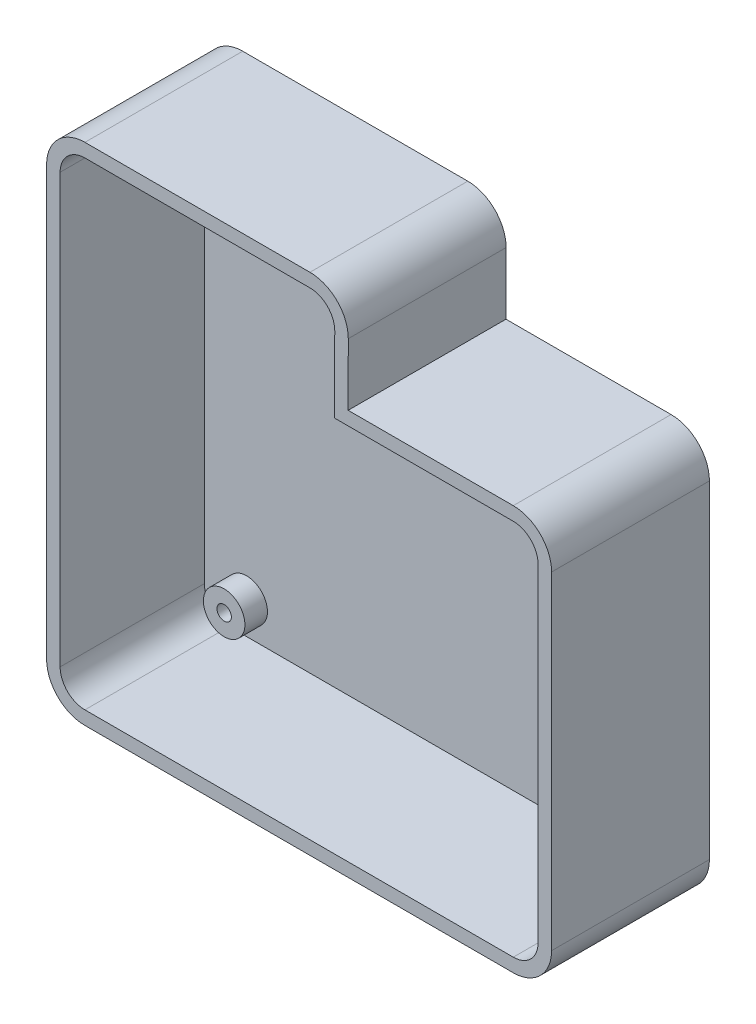
ISO-10303-21;
HEADER;
FILE_DESCRIPTION(('STEP AP214'),'2;1');
FILE_NAME('part.step','',(''),(''),'','','');
FILE_SCHEMA(('AUTOMOTIVE_DESIGN { 1 0 10303 214 1 1 1 1 }'));
ENDSEC;
DATA;
#1=APPLICATION_CONTEXT('core data for automotive mechanical design processes');
#2=APPLICATION_PROTOCOL_DEFINITION('international standard','automotive_design',2000,#1);
#3=PRODUCT_CONTEXT('',#1,'mechanical');
#4=PRODUCT('Part','Part','',(#3));
#5=PRODUCT_RELATED_PRODUCT_CATEGORY('part','',(#4));
#6=PRODUCT_DEFINITION_FORMATION('','',#4);
#7=PRODUCT_DEFINITION_CONTEXT('part definition',#1,'design');
#8=PRODUCT_DEFINITION('design','',#6,#7);
#9=PRODUCT_DEFINITION_SHAPE('','',#8);
#10=(LENGTH_UNIT() NAMED_UNIT(*) SI_UNIT(.MILLI.,.METRE.));
#11=(NAMED_UNIT(*) PLANE_ANGLE_UNIT() SI_UNIT($,.RADIAN.));
#12=(NAMED_UNIT(*) SI_UNIT($,.STERADIAN.) SOLID_ANGLE_UNIT());
#13=UNCERTAINTY_MEASURE_WITH_UNIT(LENGTH_MEASURE(1.E-05),#10,'distance_accuracy_value','');
#14=(GEOMETRIC_REPRESENTATION_CONTEXT(3) GLOBAL_UNCERTAINTY_ASSIGNED_CONTEXT((#13)) GLOBAL_UNIT_ASSIGNED_CONTEXT((#10,
#11,#12)) REPRESENTATION_CONTEXT('',''));
#15=CARTESIAN_POINT('',(0.,0.,0.));
#16=DIRECTION('',(0.,0.,1.));
#17=DIRECTION('',(1.,0.,0.));
#18=AXIS2_PLACEMENT_3D('',#15,#16,#17);
#19=CARTESIAN_POINT('',(-1.58351697458079,154.760976138155,35.));
#20=DIRECTION('',(0.,0.,-1.));
#21=DIRECTION('',(-1.,0.,0.));
#22=AXIS2_PLACEMENT_3D('',#19,#20,#21);
#23=CYLINDRICAL_SURFACE('',#22,1.6);
#24=CARTESIAN_POINT('',(-1.58351697458079,154.760976138155,0.));
#25=DIRECTION('',(0.,0.,1.));
#26=DIRECTION('',(1.,0.,0.));
#27=AXIS2_PLACEMENT_3D('',#24,#25,#26);
#28=CIRCLE('',#27,1.6);
#29=CARTESIAN_POINT('',(0.0164830254192046,154.760976138155,0.));
#30=VERTEX_POINT('',#29);
#31=EDGE_CURVE('E177',#30,#30,#28,.T.);
#32=ORIENTED_EDGE('',*,*,#31,.F.);
#33=EDGE_LOOP('',(#32));
#34=FACE_BOUND('',#33,.T.);
#35=CARTESIAN_POINT('',(-1.58351697458079,154.760976138155,8.));
#36=DIRECTION('',(0.,0.,1.));
#37=DIRECTION('',(1.,0.,0.));
#38=AXIS2_PLACEMENT_3D('',#35,#36,#37);
#39=CIRCLE('',#38,1.6);
#40=CARTESIAN_POINT('',(0.0164830254192046,154.760976138155,8.));
#41=VERTEX_POINT('',#40);
#42=EDGE_CURVE('E394',#41,#41,#39,.T.);
#43=ORIENTED_EDGE('',*,*,#42,.T.);
#44=EDGE_LOOP('',(#43));
#45=FACE_BOUND('',#44,.T.);
#46=ADVANCED_FACE('F40',(#34,#45),#23,.F.);
#47=CARTESIAN_POINT('',(38.108590223582,155.552573364995,35.));
#48=DIRECTION('',(0.,0.,-1.));
#49=DIRECTION('',(-1.,0.,0.));
#50=AXIS2_PLACEMENT_3D('',#47,#48,#49);
#51=CYLINDRICAL_SURFACE('',#50,1.6);
#52=CARTESIAN_POINT('',(38.108590223582,155.552573364995,0.));
#53=DIRECTION('',(0.,0.,1.));
#54=DIRECTION('',(1.,0.,0.));
#55=AXIS2_PLACEMENT_3D('',#52,#53,#54);
#56=CIRCLE('',#55,1.6);
#57=CARTESIAN_POINT('',(39.708590223582,155.552573364995,0.));
#58=VERTEX_POINT('',#57);
#59=EDGE_CURVE('E292',#58,#58,#56,.T.);
#60=ORIENTED_EDGE('',*,*,#59,.F.);
#61=EDGE_LOOP('',(#60));
#62=FACE_BOUND('',#61,.T.);
#63=CARTESIAN_POINT('',(38.108590223582,155.552573364995,8.));
#64=DIRECTION('',(0.,0.,1.));
#65=DIRECTION('',(1.,0.,0.));
#66=AXIS2_PLACEMENT_3D('',#63,#64,#65);
#67=CIRCLE('',#66,1.6);
#68=CARTESIAN_POINT('',(39.708590223582,155.552573364995,8.));
#69=VERTEX_POINT('',#68);
#70=EDGE_CURVE('E452',#69,#69,#67,.T.);
#71=ORIENTED_EDGE('',*,*,#70,.T.);
#72=EDGE_LOOP('',(#71));
#73=FACE_BOUND('',#72,.T.);
#74=ADVANCED_FACE('F499',(#62,#73),#51,.F.);
#75=CARTESIAN_POINT('',(-4.54984203299304,67.7845372845908,35.));
#76=DIRECTION('',(0.,0.,-1.));
#77=DIRECTION('',(-1.,0.,0.));
#78=AXIS2_PLACEMENT_3D('',#75,#76,#77);
#79=CYLINDRICAL_SURFACE('',#78,1.60000000000001);
#80=CARTESIAN_POINT('',(-4.54984203299304,67.7845372845908,0.));
#81=DIRECTION('',(0.,0.,1.));
#82=DIRECTION('',(1.,0.,0.));
#83=AXIS2_PLACEMENT_3D('',#80,#81,#82);
#84=CIRCLE('',#83,1.60000000000001);
#85=CARTESIAN_POINT('',(-2.94984203299303,67.7845372845908,0.));
#86=VERTEX_POINT('',#85);
#87=EDGE_CURVE('E296',#86,#86,#84,.T.);
#88=ORIENTED_EDGE('',*,*,#87,.F.);
#89=EDGE_LOOP('',(#88));
#90=FACE_BOUND('',#89,.T.);
#91=CARTESIAN_POINT('',(-4.54984203299304,67.7845372845908,8.));
#92=DIRECTION('',(0.,0.,1.));
#93=DIRECTION('',(1.,0.,0.));
#94=AXIS2_PLACEMENT_3D('',#91,#92,#93);
#95=CIRCLE('',#94,1.60000000000001);
#96=CARTESIAN_POINT('',(-2.94984203299303,67.7845372845908,8.));
#97=VERTEX_POINT('',#96);
#98=EDGE_CURVE('E456',#97,#97,#95,.T.);
#99=ORIENTED_EDGE('',*,*,#98,.T.);
#100=EDGE_LOOP('',(#99));
#101=FACE_BOUND('',#100,.T.);
#102=ADVANCED_FACE('F505',(#90,#101),#79,.F.);
#103=CARTESIAN_POINT('',(76.8180231596768,70.2074516428605,35.));
#104=DIRECTION('',(0.,0.,-1.));
#105=DIRECTION('',(-1.,0.,0.));
#106=AXIS2_PLACEMENT_3D('',#103,#104,#105);
#107=CYLINDRICAL_SURFACE('',#106,1.60000000000002);
#108=CARTESIAN_POINT('',(76.8180231596768,70.2074516428605,0.));
#109=DIRECTION('',(0.,0.,1.));
#110=DIRECTION('',(1.,0.,0.));
#111=AXIS2_PLACEMENT_3D('',#108,#109,#110);
#112=CIRCLE('',#111,1.60000000000002);
#113=CARTESIAN_POINT('',(78.4180231596768,70.2074516428605,0.));
#114=VERTEX_POINT('',#113);
#115=EDGE_CURVE('E300',#114,#114,#112,.T.);
#116=ORIENTED_EDGE('',*,*,#115,.F.);
#117=EDGE_LOOP('',(#116));
#118=FACE_BOUND('',#117,.T.);
#119=CARTESIAN_POINT('',(76.8180231596768,70.2074516428605,8.));
#120=DIRECTION('',(0.,0.,1.));
#121=DIRECTION('',(1.,0.,0.));
#122=AXIS2_PLACEMENT_3D('',#119,#120,#121);
#123=CIRCLE('',#122,1.60000000000002);
#124=CARTESIAN_POINT('',(78.4180231596768,70.2074516428605,8.));
#125=VERTEX_POINT('',#124);
#126=EDGE_CURVE('E460',#125,#125,#123,.T.);
#127=ORIENTED_EDGE('',*,*,#126,.T.);
#128=EDGE_LOOP('',(#127));
#129=FACE_BOUND('',#128,.T.);
#130=ADVANCED_FACE('F695',(#118,#129),#107,.F.);
#131=CARTESIAN_POINT('',(-1.58351697458079,154.760976138155,35.));
#132=DIRECTION('',(0.,0.,-1.));
#133=DIRECTION('',(-1.,0.,0.));
#134=AXIS2_PLACEMENT_3D('',#131,#132,#133);
#135=CYLINDRICAL_SURFACE('',#134,4.6);
#136=CARTESIAN_POINT('',(-1.58351697458079,154.760976138155,3.));
#137=DIRECTION('',(0.,0.,1.));
#138=DIRECTION('',(1.,0.,0.));
#139=AXIS2_PLACEMENT_3D('',#136,#137,#138);
#140=CIRCLE('',#139,4.6);
#141=CARTESIAN_POINT('',(3.0164830254192,154.760976138155,3.));
#142=VERTEX_POINT('',#141);
#143=EDGE_CURVE('E402',#142,#142,#140,.T.);
#144=ORIENTED_EDGE('',*,*,#143,.T.);
#145=EDGE_LOOP('',(#144));
#146=FACE_BOUND('',#145,.T.);
#147=CARTESIAN_POINT('',(-1.58351697458079,154.760976138155,8.));
#148=DIRECTION('',(0.,0.,1.));
#149=DIRECTION('',(1.,0.,0.));
#150=AXIS2_PLACEMENT_3D('',#147,#148,#149);
#151=CIRCLE('',#150,4.6);
#152=CARTESIAN_POINT('',(3.0164830254192,154.760976138155,8.));
#153=VERTEX_POINT('',#152);
#154=EDGE_CURVE('E464',#153,#153,#151,.T.);
#155=ORIENTED_EDGE('',*,*,#154,.F.);
#156=EDGE_LOOP('',(#155));
#157=FACE_BOUND('',#156,.T.);
#158=ADVANCED_FACE('F704',(#146,#157),#135,.T.);
#159=CARTESIAN_POINT('',(38.108590223582,155.552573364995,35.));
#160=DIRECTION('',(0.,0.,-1.));
#161=DIRECTION('',(-1.,0.,0.));
#162=AXIS2_PLACEMENT_3D('',#159,#160,#161);
#163=CYLINDRICAL_SURFACE('',#162,4.6);
#164=CARTESIAN_POINT('',(38.108590223582,155.552573364995,3.));
#165=DIRECTION('',(0.,0.,1.));
#166=DIRECTION('',(1.,0.,0.));
#167=AXIS2_PLACEMENT_3D('',#164,#165,#166);
#168=CIRCLE('',#167,4.6);
#169=CARTESIAN_POINT('',(42.708590223582,155.552573364995,3.));
#170=VERTEX_POINT('',#169);
#171=EDGE_CURVE('E398',#170,#170,#168,.T.);
#172=ORIENTED_EDGE('',*,*,#171,.T.);
#173=EDGE_LOOP('',(#172));
#174=FACE_BOUND('',#173,.T.);
#175=CARTESIAN_POINT('',(38.108590223582,155.552573364995,8.));
#176=DIRECTION('',(0.,0.,1.));
#177=DIRECTION('',(1.,0.,0.));
#178=AXIS2_PLACEMENT_3D('',#175,#176,#177);
#179=CIRCLE('',#178,4.6);
#180=CARTESIAN_POINT('',(42.708590223582,155.552573364995,8.));
#181=VERTEX_POINT('',#180);
#182=EDGE_CURVE('E468',#181,#181,#179,.T.);
#183=ORIENTED_EDGE('',*,*,#182,.F.);
#184=EDGE_LOOP('',(#183));
#185=FACE_BOUND('',#184,.T.);
#186=ADVANCED_FACE('F494',(#174,#185),#163,.T.);
#187=CARTESIAN_POINT('',(-4.54984203299304,67.7845372845908,35.));
#188=DIRECTION('',(0.,0.,-1.));
#189=DIRECTION('',(-1.,0.,0.));
#190=AXIS2_PLACEMENT_3D('',#187,#188,#189);
#191=CYLINDRICAL_SURFACE('',#190,4.60000000000001);
#192=CARTESIAN_POINT('',(-4.54984203299304,67.7845372845908,3.));
#193=DIRECTION('',(0.,0.,1.));
#194=DIRECTION('',(1.,0.,0.));
#195=AXIS2_PLACEMENT_3D('',#192,#193,#194);
#196=CIRCLE('',#195,4.60000000000001);
#197=CARTESIAN_POINT('',(0.0501579670069714,67.7845372845908,3.));
#198=VERTEX_POINT('',#197);
#199=EDGE_CURVE('E393',#198,#198,#196,.T.);
#200=ORIENTED_EDGE('',*,*,#199,.T.);
#201=EDGE_LOOP('',(#200));
#202=FACE_BOUND('',#201,.T.);
#203=CARTESIAN_POINT('',(-4.54984203299304,67.7845372845908,8.));
#204=DIRECTION('',(0.,0.,1.));
#205=DIRECTION('',(1.,0.,0.));
#206=AXIS2_PLACEMENT_3D('',#203,#204,#205);
#207=CIRCLE('',#206,4.60000000000001);
#208=CARTESIAN_POINT('',(0.0501579670069714,67.7845372845908,8.));
#209=VERTEX_POINT('',#208);
#210=EDGE_CURVE('E472',#209,#209,#207,.T.);
#211=ORIENTED_EDGE('',*,*,#210,.F.);
#212=EDGE_LOOP('',(#211));
#213=FACE_BOUND('',#212,.T.);
#214=ADVANCED_FACE('F485',(#202,#213),#191,.T.);
#215=CARTESIAN_POINT('',(76.8180231596768,70.2074516428605,35.));
#216=DIRECTION('',(0.,0.,-1.));
#217=DIRECTION('',(-1.,0.,0.));
#218=AXIS2_PLACEMENT_3D('',#215,#216,#217);
#219=CYLINDRICAL_SURFACE('',#218,4.60000000000002);
#220=CARTESIAN_POINT('',(76.8180231596768,70.2074516428605,3.));
#221=DIRECTION('',(0.,0.,1.));
#222=DIRECTION('',(1.,0.,0.));
#223=AXIS2_PLACEMENT_3D('',#220,#221,#222);
#224=CIRCLE('',#223,4.60000000000002);
#225=CARTESIAN_POINT('',(81.4180231596768,70.2074516428605,3.));
#226=VERTEX_POINT('',#225);
#227=EDGE_CURVE('E389',#226,#226,#224,.T.);
#228=ORIENTED_EDGE('',*,*,#227,.T.);
#229=EDGE_LOOP('',(#228));
#230=FACE_BOUND('',#229,.T.);
#231=CARTESIAN_POINT('',(76.8180231596768,70.2074516428605,8.));
#232=DIRECTION('',(0.,0.,1.));
#233=DIRECTION('',(1.,0.,0.));
#234=AXIS2_PLACEMENT_3D('',#231,#232,#233);
#235=CIRCLE('',#234,4.60000000000002);
#236=CARTESIAN_POINT('',(81.4180231596768,70.2074516428605,8.));
#237=VERTEX_POINT('',#236);
#238=EDGE_CURVE('E44',#237,#237,#235,.T.);
#239=ORIENTED_EDGE('',*,*,#238,.F.);
#240=EDGE_LOOP('',(#239));
#241=FACE_BOUND('',#240,.T.);
#242=ADVANCED_FACE('F483',(#230,#241),#219,.T.);
#243=CARTESIAN_POINT('',(41.4795864296568,161.203196000859,35.));
#244=DIRECTION('',(0.,0.,1.));
#245=DIRECTION('',(1.,0.,0.));
#246=AXIS2_PLACEMENT_3D('',#243,#244,#245);
#247=PLANE('',#246);
#248=CARTESIAN_POINT('',(41.4795864296568,161.203196000859,35.));
#249=DIRECTION('',(0.,0.,1.));
#250=DIRECTION('',(1.,0.,0.));
#251=AXIS2_PLACEMENT_3D('',#248,#249,#250);
#252=CIRCLE('',#251,5.5);
#253=CARTESIAN_POINT('',(46.9795855552108,161.206297439952,35.));
#254=VERTEX_POINT('',#253);
#255=CARTESIAN_POINT('',(41.4795864296568,166.703196000859,35.));
#256=VERTEX_POINT('',#255);
#257=EDGE_CURVE('E344',#254,#256,#252,.T.);
#258=ORIENTED_EDGE('',*,*,#257,.F.);
#259=DIRECTION('',(0.00231900740812361,0.999997311098705,0.));
#260=VECTOR('',#259,1.);
#261=CARTESIAN_POINT('',(46.9476384883502,147.430153023083,35.));
#262=LINE('',#261,#260);
#263=CARTESIAN_POINT('',(46.9406653139895,144.423196000859,35.));
#264=VERTEX_POINT('',#263);
#265=EDGE_CURVE('E305',#264,#254,#262,.T.);
#266=ORIENTED_EDGE('',*,*,#265,.F.);
#267=DIRECTION('',(-1.,0.,0.));
#268=VECTOR('',#267,1.);
#269=CARTESIAN_POINT('',(50.2895864296568,144.423196000859,35.));
#270=LINE('',#269,#268);
#271=CARTESIAN_POINT('',(86.5695864296568,144.423196000859,35.));
#272=VERTEX_POINT('',#271);
#273=EDGE_CURVE('E309',#272,#264,#270,.T.);
#274=ORIENTED_EDGE('',*,*,#273,.F.);
#275=CARTESIAN_POINT('',(86.5695864296568,138.923196000859,35.));
#276=DIRECTION('',(0.,0.,1.));
#277=DIRECTION('',(1.,0.,0.));
#278=AXIS2_PLACEMENT_3D('',#275,#276,#277);
#279=CIRCLE('',#278,5.49999999999999);
#280=CARTESIAN_POINT('',(92.0695864296568,138.923196000859,35.));
#281=VERTEX_POINT('',#280);
#282=EDGE_CURVE('E312',#281,#272,#279,.T.);
#283=ORIENTED_EDGE('',*,*,#282,.F.);
#284=DIRECTION('',(0.,1.,0.));
#285=VECTOR('',#284,1.);
#286=CARTESIAN_POINT('',(92.0695864296568,66.2031960008587,35.));
#287=LINE('',#286,#285);
#288=CARTESIAN_POINT('',(92.0695864296568,66.2031960008587,35.));
#289=VERTEX_POINT('',#288);
#290=EDGE_CURVE('E316',#289,#281,#287,.T.);
#291=ORIENTED_EDGE('',*,*,#290,.F.);
#292=CARTESIAN_POINT('',(86.5695864296568,66.2031960008587,35.));
#293=DIRECTION('',(0.,0.,1.));
#294=DIRECTION('',(1.,0.,0.));
#295=AXIS2_PLACEMENT_3D('',#292,#293,#294);
#296=CIRCLE('',#295,5.5);
#297=CARTESIAN_POINT('',(86.5695864296568,60.7031960008587,35.));
#298=VERTEX_POINT('',#297);
#299=EDGE_CURVE('E320',#298,#289,#296,.T.);
#300=ORIENTED_EDGE('',*,*,#299,.F.);
#301=DIRECTION('',(1.,0.,0.));
#302=VECTOR('',#301,1.);
#303=CARTESIAN_POINT('',(-8.43041357034322,60.7031960008587,35.));
#304=LINE('',#303,#302);
#305=CARTESIAN_POINT('',(-8.43041357034322,60.7031960008587,35.));
#306=VERTEX_POINT('',#305);
#307=EDGE_CURVE('E324',#306,#298,#304,.T.);
#308=ORIENTED_EDGE('',*,*,#307,.F.);
#309=CARTESIAN_POINT('',(-8.43041357034322,66.2031960008587,35.));
#310=DIRECTION('',(0.,0.,1.));
#311=DIRECTION('',(1.,0.,0.));
#312=AXIS2_PLACEMENT_3D('',#309,#310,#311);
#313=CIRCLE('',#312,5.5);
#314=CARTESIAN_POINT('',(-13.9304135703432,66.2031960008587,35.));
#315=VERTEX_POINT('',#314);
#316=EDGE_CURVE('E328',#315,#306,#313,.T.);
#317=ORIENTED_EDGE('',*,*,#316,.F.);
#318=DIRECTION('',(0.,-1.,0.));
#319=VECTOR('',#318,1.);
#320=CARTESIAN_POINT('',(-13.9304135703432,161.203196000859,35.));
#321=LINE('',#320,#319);
#322=CARTESIAN_POINT('',(-13.9304135703432,161.203196000859,35.));
#323=VERTEX_POINT('',#322);
#324=EDGE_CURVE('E332',#323,#315,#321,.T.);
#325=ORIENTED_EDGE('',*,*,#324,.F.);
#326=CARTESIAN_POINT('',(-8.43041357034322,161.203196000859,35.));
#327=DIRECTION('',(0.,0.,1.));
#328=DIRECTION('',(1.,0.,0.));
#329=AXIS2_PLACEMENT_3D('',#326,#327,#328);
#330=CIRCLE('',#329,5.5);
#331=CARTESIAN_POINT('',(-8.43041357034322,166.703196000859,35.));
#332=VERTEX_POINT('',#331);
#333=EDGE_CURVE('E336',#332,#323,#330,.T.);
#334=ORIENTED_EDGE('',*,*,#333,.F.);
#335=DIRECTION('',(-1.,0.,0.));
#336=VECTOR('',#335,1.);
#337=CARTESIAN_POINT('',(41.4795864296568,166.703196000859,35.));
#338=LINE('',#337,#336);
#339=EDGE_CURVE('E340',#256,#332,#338,.T.);
#340=ORIENTED_EDGE('',*,*,#339,.F.);
#341=EDGE_LOOP('',(#258,#266,#274,#283,#291,#300,#308,#317,#325,#334,#340));
#342=FACE_BOUND('',#341,.T.);
#343=CARTESIAN_POINT('',(41.4795864296568,161.203196000859,35.));
#344=DIRECTION('',(0.,0.,1.));
#345=DIRECTION('',(1.,0.,0.));
#346=AXIS2_PLACEMENT_3D('',#343,#344,#345);
#347=CIRCLE('',#346,8.5);
#348=CARTESIAN_POINT('',(49.9795864296568,161.203196000859,35.));
#349=VERTEX_POINT('',#348);
#350=CARTESIAN_POINT('',(41.4795864296568,169.703196000859,35.));
#351=VERTEX_POINT('',#350);
#352=EDGE_CURVE('E205',#349,#351,#347,.T.);
#353=ORIENTED_EDGE('',*,*,#352,.T.);
#354=DIRECTION('',(-1.,0.,0.));
#355=VECTOR('',#354,1.);
#356=CARTESIAN_POINT('',(41.4795864296568,169.703196000859,35.));
#357=LINE('',#356,#355);
#358=CARTESIAN_POINT('',(-8.43041357034322,169.703196000859,35.));
#359=VERTEX_POINT('',#358);
#360=EDGE_CURVE('E116',#351,#359,#357,.T.);
#361=ORIENTED_EDGE('',*,*,#360,.T.);
#362=CARTESIAN_POINT('',(-8.43041357034322,161.203196000859,35.));
#363=DIRECTION('',(0.,0.,1.));
#364=DIRECTION('',(1.,0.,0.));
#365=AXIS2_PLACEMENT_3D('',#362,#363,#364);
#366=CIRCLE('',#365,8.5);
#367=CARTESIAN_POINT('',(-16.9304135703432,161.203196000859,35.));
#368=VERTEX_POINT('',#367);
#369=EDGE_CURVE('E239',#359,#368,#366,.T.);
#370=ORIENTED_EDGE('',*,*,#369,.T.);
#371=DIRECTION('',(0.,-1.,0.));
#372=VECTOR('',#371,1.);
#373=CARTESIAN_POINT('',(-16.9304135703432,161.203196000859,35.));
#374=LINE('',#373,#372);
#375=CARTESIAN_POINT('',(-16.9304135703432,66.2031960008587,35.));
#376=VERTEX_POINT('',#375);
#377=EDGE_CURVE('E259',#368,#376,#374,.T.);
#378=ORIENTED_EDGE('',*,*,#377,.T.);
#379=CARTESIAN_POINT('',(-8.43041357034322,66.2031960008587,35.));
#380=DIRECTION('',(0.,0.,1.));
#381=DIRECTION('',(1.,0.,0.));
#382=AXIS2_PLACEMENT_3D('',#379,#380,#381);
#383=CIRCLE('',#382,8.5);
#384=CARTESIAN_POINT('',(-8.43041357034322,57.7031960008587,35.));
#385=VERTEX_POINT('',#384);
#386=EDGE_CURVE('E255',#376,#385,#383,.T.);
#387=ORIENTED_EDGE('',*,*,#386,.T.);
#388=DIRECTION('',(1.,0.,0.));
#389=VECTOR('',#388,1.);
#390=CARTESIAN_POINT('',(-8.43041357034322,57.7031960008587,35.));
#391=LINE('',#390,#389);
#392=CARTESIAN_POINT('',(86.5695864296568,57.7031960008587,35.));
#393=VERTEX_POINT('',#392);
#394=EDGE_CURVE('E258',#385,#393,#391,.T.);
#395=ORIENTED_EDGE('',*,*,#394,.T.);
#396=CARTESIAN_POINT('',(86.5695864296568,66.2031960008587,35.));
#397=DIRECTION('',(0.,0.,1.));
#398=DIRECTION('',(1.,0.,0.));
#399=AXIS2_PLACEMENT_3D('',#396,#397,#398);
#400=CIRCLE('',#399,8.5);
#401=CARTESIAN_POINT('',(95.0695864296568,66.2031960008587,35.));
#402=VERTEX_POINT('',#401);
#403=EDGE_CURVE('E263',#393,#402,#400,.T.);
#404=ORIENTED_EDGE('',*,*,#403,.T.);
#405=DIRECTION('',(0.,1.,0.));
#406=VECTOR('',#405,1.);
#407=CARTESIAN_POINT('',(95.0695864296568,66.2031960008587,35.));
#408=LINE('',#407,#406);
#409=CARTESIAN_POINT('',(95.0695864296568,138.923196000859,35.));
#410=VERTEX_POINT('',#409);
#411=EDGE_CURVE('E147',#402,#410,#408,.T.);
#412=ORIENTED_EDGE('',*,*,#411,.T.);
#413=CARTESIAN_POINT('',(86.5695864296568,138.923196000859,35.));
#414=DIRECTION('',(0.,0.,1.));
#415=DIRECTION('',(1.,0.,0.));
#416=AXIS2_PLACEMENT_3D('',#413,#414,#415);
#417=CIRCLE('',#416,8.49999999999999);
#418=CARTESIAN_POINT('',(86.5695864296568,147.423196000859,35.));
#419=VERTEX_POINT('',#418);
#420=EDGE_CURVE('E140',#410,#419,#417,.T.);
#421=ORIENTED_EDGE('',*,*,#420,.T.);
#422=DIRECTION('',(-1.,0.,0.));
#423=VECTOR('',#422,1.);
#424=CARTESIAN_POINT('',(86.5695864296568,147.423196000859,35.));
#425=LINE('',#424,#423);
#426=CARTESIAN_POINT('',(49.9476304216463,147.423196000859,35.));
#427=VERTEX_POINT('',#426);
#428=EDGE_CURVE('E144',#419,#427,#425,.T.);
#429=ORIENTED_EDGE('',*,*,#428,.T.);
#430=DIRECTION('',(0.00231900740812361,0.999997311098705,0.));
#431=VECTOR('',#430,1.);
#432=CARTESIAN_POINT('',(49.9476304216463,147.423196000859,35.));
#433=LINE('',#432,#431);
#434=EDGE_CURVE('E66',#427,#349,#433,.T.);
#435=ORIENTED_EDGE('',*,*,#434,.T.);
#436=EDGE_LOOP('',(#353,#361,#370,#378,#387,#395,#404,#412,#421,#429,#435));
#437=FACE_BOUND('',#436,.T.);
#438=ADVANCED_FACE('F142',(#342,#437),#247,.T.);
#439=CARTESIAN_POINT('',(41.4795864296568,161.203196000859,0.));
#440=DIRECTION('',(0.,0.,1.));
#441=DIRECTION('',(1.,0.,0.));
#442=AXIS2_PLACEMENT_3D('',#439,#440,#441);
#443=PLANE('',#442);
#444=CARTESIAN_POINT('',(41.4795864296568,161.203196000859,0.));
#445=DIRECTION('',(0.,0.,1.));
#446=DIRECTION('',(1.,0.,0.));
#447=AXIS2_PLACEMENT_3D('',#444,#445,#446);
#448=CIRCLE('',#447,8.5);
#449=CARTESIAN_POINT('',(49.9795864296568,161.203196000859,0.));
#450=VERTEX_POINT('',#449);
#451=CARTESIAN_POINT('',(41.4795864296568,169.703196000859,0.));
#452=VERTEX_POINT('',#451);
#453=EDGE_CURVE('E172',#450,#452,#448,.T.);
#454=ORIENTED_EDGE('',*,*,#453,.F.);
#455=DIRECTION('',(0.00231900740812361,0.999997311098705,0.));
#456=VECTOR('',#455,1.);
#457=CARTESIAN_POINT('',(49.9476304216463,147.423196000859,0.));
#458=LINE('',#457,#456);
#459=CARTESIAN_POINT('',(49.9476304216463,147.423196000859,0.));
#460=VERTEX_POINT('',#459);
#461=EDGE_CURVE('E108',#460,#450,#458,.T.);
#462=ORIENTED_EDGE('',*,*,#461,.F.);
#463=DIRECTION('',(-1.,0.,0.));
#464=VECTOR('',#463,1.);
#465=CARTESIAN_POINT('',(50.2895864296568,147.423196000859,0.));
#466=LINE('',#465,#464);
#467=CARTESIAN_POINT('',(86.5695864296568,147.423196000859,0.));
#468=VERTEX_POINT('',#467);
#469=EDGE_CURVE('E200',#468,#460,#466,.T.);
#470=ORIENTED_EDGE('',*,*,#469,.F.);
#471=CARTESIAN_POINT('',(86.5695864296568,138.923196000859,0.));
#472=DIRECTION('',(0.,0.,1.));
#473=DIRECTION('',(1.,0.,0.));
#474=AXIS2_PLACEMENT_3D('',#471,#472,#473);
#475=CIRCLE('',#474,8.49999999999999);
#476=CARTESIAN_POINT('',(95.0695864296568,138.923196000859,0.));
#477=VERTEX_POINT('',#476);
#478=EDGE_CURVE('E158',#477,#468,#475,.T.);
#479=ORIENTED_EDGE('',*,*,#478,.F.);
#480=DIRECTION('',(0.,1.,0.));
#481=VECTOR('',#480,1.);
#482=CARTESIAN_POINT('',(95.0695864296568,66.2031960008587,0.));
#483=LINE('',#482,#481);
#484=CARTESIAN_POINT('',(95.0695864296568,66.2031960008587,0.));
#485=VERTEX_POINT('',#484);
#486=EDGE_CURVE('E195',#485,#477,#483,.T.);
#487=ORIENTED_EDGE('',*,*,#486,.F.);
#488=CARTESIAN_POINT('',(86.5695864296568,66.2031960008587,0.));
#489=DIRECTION('',(0.,0.,1.));
#490=DIRECTION('',(1.,0.,0.));
#491=AXIS2_PLACEMENT_3D('',#488,#489,#490);
#492=CIRCLE('',#491,8.5);
#493=CARTESIAN_POINT('',(86.5695864296568,57.7031960008587,0.));
#494=VERTEX_POINT('',#493);
#495=EDGE_CURVE('E192',#494,#485,#492,.T.);
#496=ORIENTED_EDGE('',*,*,#495,.F.);
#497=DIRECTION('',(1.,0.,0.));
#498=VECTOR('',#497,1.);
#499=CARTESIAN_POINT('',(-8.43041357034322,57.7031960008587,0.));
#500=LINE('',#499,#498);
#501=CARTESIAN_POINT('',(-8.43041357034322,57.7031960008587,0.));
#502=VERTEX_POINT('',#501);
#503=EDGE_CURVE('E189',#502,#494,#500,.T.);
#504=ORIENTED_EDGE('',*,*,#503,.F.);
#505=CARTESIAN_POINT('',(-8.43041357034322,66.2031960008587,0.));
#506=DIRECTION('',(0.,0.,1.));
#507=DIRECTION('',(1.,0.,0.));
#508=AXIS2_PLACEMENT_3D('',#505,#506,#507);
#509=CIRCLE('',#508,8.5);
#510=CARTESIAN_POINT('',(-16.9304135703432,66.2031960008587,0.));
#511=VERTEX_POINT('',#510);
#512=EDGE_CURVE('E186',#511,#502,#509,.T.);
#513=ORIENTED_EDGE('',*,*,#512,.F.);
#514=DIRECTION('',(0.,-1.,0.));
#515=VECTOR('',#514,1.);
#516=CARTESIAN_POINT('',(-16.9304135703432,161.203196000859,0.));
#517=LINE('',#516,#515);
#518=CARTESIAN_POINT('',(-16.9304135703432,161.203196000859,0.));
#519=VERTEX_POINT('',#518);
#520=EDGE_CURVE('E183',#519,#511,#517,.T.);
#521=ORIENTED_EDGE('',*,*,#520,.F.);
#522=CARTESIAN_POINT('',(-8.43041357034322,161.203196000859,0.));
#523=DIRECTION('',(0.,0.,1.));
#524=DIRECTION('',(1.,0.,0.));
#525=AXIS2_PLACEMENT_3D('',#522,#523,#524);
#526=CIRCLE('',#525,8.5);
#527=CARTESIAN_POINT('',(-8.43041357034322,169.703196000859,0.));
#528=VERTEX_POINT('',#527);
#529=EDGE_CURVE('E180',#528,#519,#526,.T.);
#530=ORIENTED_EDGE('',*,*,#529,.F.);
#531=DIRECTION('',(-1.,0.,0.));
#532=VECTOR('',#531,1.);
#533=CARTESIAN_POINT('',(41.4795864296568,169.703196000859,0.));
#534=LINE('',#533,#532);
#535=EDGE_CURVE('E176',#452,#528,#534,.T.);
#536=ORIENTED_EDGE('',*,*,#535,.F.);
#537=EDGE_LOOP('',(#454,#462,#470,#479,#487,#496,#504,#513,#521,#530,#536));
#538=FACE_BOUND('',#537,.T.);
#539=ORIENTED_EDGE('',*,*,#31,.T.);
#540=EDGE_LOOP('',(#539));
#541=FACE_BOUND('',#540,.T.);
#542=ORIENTED_EDGE('',*,*,#59,.T.);
#543=EDGE_LOOP('',(#542));
#544=FACE_BOUND('',#543,.T.);
#545=ORIENTED_EDGE('',*,*,#87,.T.);
#546=EDGE_LOOP('',(#545));
#547=FACE_BOUND('',#546,.T.);
#548=ORIENTED_EDGE('',*,*,#115,.T.);
#549=EDGE_LOOP('',(#548));
#550=FACE_BOUND('',#549,.T.);
#551=ADVANCED_FACE('F243',(#538,#541,#544,#547,#550),#443,.F.);
#552=CARTESIAN_POINT('',(41.4795864296568,161.203196000859,35.));
#553=DIRECTION('',(0.,0.,-1.));
#554=DIRECTION('',(-1.,0.,0.));
#555=AXIS2_PLACEMENT_3D('',#552,#553,#554);
#556=CYLINDRICAL_SURFACE('',#555,8.5);
#557=ORIENTED_EDGE('',*,*,#453,.T.);
#558=DIRECTION('',(0.,0.,-1.));
#559=VECTOR('',#558,1.);
#560=CARTESIAN_POINT('',(41.4795864296568,169.703196000859,35.));
#561=LINE('',#560,#559);
#562=EDGE_CURVE('E13',#351,#452,#561,.T.);
#563=ORIENTED_EDGE('',*,*,#562,.F.);
#564=ORIENTED_EDGE('',*,*,#352,.F.);
#565=DIRECTION('',(0.,0.,-1.));
#566=VECTOR('',#565,1.);
#567=CARTESIAN_POINT('',(49.9795864296568,161.203196000859,35.));
#568=LINE('',#567,#566);
#569=EDGE_CURVE('E168',#349,#450,#568,.T.);
#570=ORIENTED_EDGE('',*,*,#569,.T.);
#571=EDGE_LOOP('',(#557,#563,#564,#570));
#572=FACE_BOUND('',#571,.T.);
#573=ADVANCED_FACE('F42',(#572),#556,.T.);
#574=CARTESIAN_POINT('',(41.4795864296568,169.703196000859,35.));
#575=DIRECTION('',(0.,-1.,0.));
#576=DIRECTION('',(0.,0.,-1.));
#577=AXIS2_PLACEMENT_3D('',#574,#575,#576);
#578=PLANE('',#577);
#579=ORIENTED_EDGE('',*,*,#535,.T.);
#580=DIRECTION('',(0.,0.,-1.));
#581=VECTOR('',#580,1.);
#582=CARTESIAN_POINT('',(-8.43041357034322,169.703196000859,35.));
#583=LINE('',#582,#581);
#584=EDGE_CURVE('E50',#359,#528,#583,.T.);
#585=ORIENTED_EDGE('',*,*,#584,.F.);
#586=ORIENTED_EDGE('',*,*,#360,.F.);
#587=ORIENTED_EDGE('',*,*,#562,.T.);
#588=EDGE_LOOP('',(#579,#585,#586,#587));
#589=FACE_BOUND('',#588,.T.);
#590=ADVANCED_FACE('F534',(#589),#578,.F.);
#591=CARTESIAN_POINT('',(-8.43041357034322,161.203196000859,35.));
#592=DIRECTION('',(0.,0.,-1.));
#593=DIRECTION('',(-1.,0.,0.));
#594=AXIS2_PLACEMENT_3D('',#591,#592,#593);
#595=CYLINDRICAL_SURFACE('',#594,8.5);
#596=ORIENTED_EDGE('',*,*,#529,.T.);
#597=DIRECTION('',(0.,0.,-1.));
#598=VECTOR('',#597,1.);
#599=CARTESIAN_POINT('',(-16.9304135703432,161.203196000859,35.));
#600=LINE('',#599,#598);
#601=EDGE_CURVE('E228',#368,#519,#600,.T.);
#602=ORIENTED_EDGE('',*,*,#601,.F.);
#603=ORIENTED_EDGE('',*,*,#369,.F.);
#604=ORIENTED_EDGE('',*,*,#584,.T.);
#605=EDGE_LOOP('',(#596,#602,#603,#604));
#606=FACE_BOUND('',#605,.T.);
#607=ADVANCED_FACE('F237',(#606),#595,.T.);
#608=CARTESIAN_POINT('',(-16.9304135703432,161.203196000859,35.));
#609=DIRECTION('',(1.,0.,0.));
#610=DIRECTION('',(0.,0.,-1.));
#611=AXIS2_PLACEMENT_3D('',#608,#609,#610);
#612=PLANE('',#611);
#613=ORIENTED_EDGE('',*,*,#520,.T.);
#614=DIRECTION('',(0.,0.,-1.));
#615=VECTOR('',#614,1.);
#616=CARTESIAN_POINT('',(-16.9304135703432,66.2031960008587,35.));
#617=LINE('',#616,#615);
#618=EDGE_CURVE('E224',#376,#511,#617,.T.);
#619=ORIENTED_EDGE('',*,*,#618,.F.);
#620=ORIENTED_EDGE('',*,*,#377,.F.);
#621=ORIENTED_EDGE('',*,*,#601,.T.);
#622=EDGE_LOOP('',(#613,#619,#620,#621));
#623=FACE_BOUND('',#622,.T.);
#624=ADVANCED_FACE('F249',(#623),#612,.F.);
#625=CARTESIAN_POINT('',(-8.43041357034322,66.2031960008587,35.));
#626=DIRECTION('',(0.,0.,-1.));
#627=DIRECTION('',(-1.,0.,0.));
#628=AXIS2_PLACEMENT_3D('',#625,#626,#627);
#629=CYLINDRICAL_SURFACE('',#628,8.5);
#630=ORIENTED_EDGE('',*,*,#512,.T.);
#631=DIRECTION('',(0.,0.,-1.));
#632=VECTOR('',#631,1.);
#633=CARTESIAN_POINT('',(-8.43041357034322,57.7031960008587,35.));
#634=LINE('',#633,#632);
#635=EDGE_CURVE('E220',#385,#502,#634,.T.);
#636=ORIENTED_EDGE('',*,*,#635,.F.);
#637=ORIENTED_EDGE('',*,*,#386,.F.);
#638=ORIENTED_EDGE('',*,*,#618,.T.);
#639=EDGE_LOOP('',(#630,#636,#637,#638));
#640=FACE_BOUND('',#639,.T.);
#641=ADVANCED_FACE('F253',(#640),#629,.T.);
#642=CARTESIAN_POINT('',(-8.43041357034322,57.7031960008587,35.));
#643=DIRECTION('',(0.,1.,0.));
#644=DIRECTION('',(0.,0.,1.));
#645=AXIS2_PLACEMENT_3D('',#642,#643,#644);
#646=PLANE('',#645);
#647=ORIENTED_EDGE('',*,*,#503,.T.);
#648=DIRECTION('',(0.,0.,-1.));
#649=VECTOR('',#648,1.);
#650=CARTESIAN_POINT('',(86.5695864296568,57.7031960008587,35.));
#651=LINE('',#650,#649);
#652=EDGE_CURVE('E216',#393,#494,#651,.T.);
#653=ORIENTED_EDGE('',*,*,#652,.F.);
#654=ORIENTED_EDGE('',*,*,#394,.F.);
#655=ORIENTED_EDGE('',*,*,#635,.T.);
#656=EDGE_LOOP('',(#647,#653,#654,#655));
#657=FACE_BOUND('',#656,.T.);
#658=ADVANCED_FACE('F525',(#657),#646,.F.);
#659=CARTESIAN_POINT('',(86.5695864296568,66.2031960008587,35.));
#660=DIRECTION('',(0.,0.,-1.));
#661=DIRECTION('',(-1.,0.,0.));
#662=AXIS2_PLACEMENT_3D('',#659,#660,#661);
#663=CYLINDRICAL_SURFACE('',#662,8.5);
#664=ORIENTED_EDGE('',*,*,#495,.T.);
#665=DIRECTION('',(0.,0.,-1.));
#666=VECTOR('',#665,1.);
#667=CARTESIAN_POINT('',(95.0695864296568,66.2031960008587,35.));
#668=LINE('',#667,#666);
#669=EDGE_CURVE('E212',#402,#485,#668,.T.);
#670=ORIENTED_EDGE('',*,*,#669,.F.);
#671=ORIENTED_EDGE('',*,*,#403,.F.);
#672=ORIENTED_EDGE('',*,*,#652,.T.);
#673=EDGE_LOOP('',(#664,#670,#671,#672));
#674=FACE_BOUND('',#673,.T.);
#675=ADVANCED_FACE('F274',(#674),#663,.T.);
#676=CARTESIAN_POINT('',(95.0695864296568,66.2031960008587,35.));
#677=DIRECTION('',(-1.,0.,0.));
#678=DIRECTION('',(0.,0.,1.));
#679=AXIS2_PLACEMENT_3D('',#676,#677,#678);
#680=PLANE('',#679);
#681=ORIENTED_EDGE('',*,*,#486,.T.);
#682=DIRECTION('',(0.,0.,-1.));
#683=VECTOR('',#682,1.);
#684=CARTESIAN_POINT('',(95.0695864296568,138.923196000859,35.));
#685=LINE('',#684,#683);
#686=EDGE_CURVE('E161',#410,#477,#685,.T.);
#687=ORIENTED_EDGE('',*,*,#686,.F.);
#688=ORIENTED_EDGE('',*,*,#411,.F.);
#689=ORIENTED_EDGE('',*,*,#669,.T.);
#690=EDGE_LOOP('',(#681,#687,#688,#689));
#691=FACE_BOUND('',#690,.T.);
#692=ADVANCED_FACE('F278',(#691),#680,.F.);
#693=CARTESIAN_POINT('',(86.5695864296568,138.923196000859,35.));
#694=DIRECTION('',(0.,0.,-1.));
#695=DIRECTION('',(-1.,0.,0.));
#696=AXIS2_PLACEMENT_3D('',#693,#694,#695);
#697=CYLINDRICAL_SURFACE('',#696,8.49999999999999);
#698=ORIENTED_EDGE('',*,*,#478,.T.);
#699=DIRECTION('',(0.,0.,-1.));
#700=VECTOR('',#699,1.);
#701=CARTESIAN_POINT('',(86.5695864296568,147.423196000859,35.));
#702=LINE('',#701,#700);
#703=EDGE_CURVE('E155',#419,#468,#702,.T.);
#704=ORIENTED_EDGE('',*,*,#703,.F.);
#705=ORIENTED_EDGE('',*,*,#420,.F.);
#706=ORIENTED_EDGE('',*,*,#686,.T.);
#707=EDGE_LOOP('',(#698,#704,#705,#706));
#708=FACE_BOUND('',#707,.T.);
#709=ADVANCED_FACE('F156',(#708),#697,.T.);
#710=CARTESIAN_POINT('',(50.2895864296568,147.423196000859,35.));
#711=DIRECTION('',(0.,-1.,0.));
#712=DIRECTION('',(0.,0.,-1.));
#713=AXIS2_PLACEMENT_3D('',#710,#711,#712);
#714=PLANE('',#713);
#715=ORIENTED_EDGE('',*,*,#469,.T.);
#716=DIRECTION('',(0.,0.,-1.));
#717=VECTOR('',#716,1.);
#718=CARTESIAN_POINT('',(49.9476304216463,147.423196000859,35.));
#719=LINE('',#718,#717);
#720=EDGE_CURVE('E162',#427,#460,#719,.T.);
#721=ORIENTED_EDGE('',*,*,#720,.F.);
#722=ORIENTED_EDGE('',*,*,#428,.F.);
#723=ORIENTED_EDGE('',*,*,#703,.T.);
#724=EDGE_LOOP('',(#715,#721,#722,#723));
#725=FACE_BOUND('',#724,.T.);
#726=ADVANCED_FACE('F164',(#725),#714,.F.);
#727=CARTESIAN_POINT('',(49.9476304216463,147.423196000859,35.));
#728=DIRECTION('',(-0.999997311098705,0.00231900740812361,0.));
#729=DIRECTION('',(-0.00231900740812361,-0.999997311098705,0.));
#730=AXIS2_PLACEMENT_3D('',#727,#728,#729);
#731=PLANE('',#730);
#732=ORIENTED_EDGE('',*,*,#461,.T.);
#733=ORIENTED_EDGE('',*,*,#569,.F.);
#734=ORIENTED_EDGE('',*,*,#434,.F.);
#735=ORIENTED_EDGE('',*,*,#720,.T.);
#736=EDGE_LOOP('',(#732,#733,#734,#735));
#737=FACE_BOUND('',#736,.T.);
#738=ADVANCED_FACE('F279',(#737),#731,.F.);
#739=CARTESIAN_POINT('',(41.4795864296568,161.203196000859,3.));
#740=DIRECTION('',(0.,0.,1.));
#741=DIRECTION('',(1.,0.,0.));
#742=AXIS2_PLACEMENT_3D('',#739,#740,#741);
#743=PLANE('',#742);
#744=CARTESIAN_POINT('',(41.4795864296568,161.203196000859,3.));
#745=DIRECTION('',(0.,0.,1.));
#746=DIRECTION('',(1.,0.,0.));
#747=AXIS2_PLACEMENT_3D('',#744,#745,#746);
#748=CIRCLE('',#747,5.5);
#749=CARTESIAN_POINT('',(46.9795855552108,161.206297439952,3.));
#750=VERTEX_POINT('',#749);
#751=CARTESIAN_POINT('',(41.4795864296568,166.703196000859,3.));
#752=VERTEX_POINT('',#751);
#753=EDGE_CURVE('E406',#750,#752,#748,.T.);
#754=ORIENTED_EDGE('',*,*,#753,.T.);
#755=DIRECTION('',(-1.,0.,0.));
#756=VECTOR('',#755,1.);
#757=CARTESIAN_POINT('',(41.4795864296568,166.703196000859,3.));
#758=LINE('',#757,#756);
#759=CARTESIAN_POINT('',(-8.43041357034322,166.703196000859,3.));
#760=VERTEX_POINT('',#759);
#761=EDGE_CURVE('E407',#752,#760,#758,.T.);
#762=ORIENTED_EDGE('',*,*,#761,.T.);
#763=CARTESIAN_POINT('',(-8.43041357034322,161.203196000859,3.));
#764=DIRECTION('',(0.,0.,1.));
#765=DIRECTION('',(1.,0.,0.));
#766=AXIS2_PLACEMENT_3D('',#763,#764,#765);
#767=CIRCLE('',#766,5.5);
#768=CARTESIAN_POINT('',(-13.9304135703432,161.203196000859,3.));
#769=VERTEX_POINT('',#768);
#770=EDGE_CURVE('E411',#760,#769,#767,.T.);
#771=ORIENTED_EDGE('',*,*,#770,.T.);
#772=DIRECTION('',(0.,-1.,0.));
#773=VECTOR('',#772,1.);
#774=CARTESIAN_POINT('',(-13.9304135703432,161.203196000859,3.));
#775=LINE('',#774,#773);
#776=CARTESIAN_POINT('',(-13.9304135703432,66.2031960008587,3.));
#777=VERTEX_POINT('',#776);
#778=EDGE_CURVE('E415',#769,#777,#775,.T.);
#779=ORIENTED_EDGE('',*,*,#778,.T.);
#780=CARTESIAN_POINT('',(-8.43041357034322,66.2031960008587,3.));
#781=DIRECTION('',(0.,0.,1.));
#782=DIRECTION('',(1.,0.,0.));
#783=AXIS2_PLACEMENT_3D('',#780,#781,#782);
#784=CIRCLE('',#783,5.5);
#785=CARTESIAN_POINT('',(-8.43041357034322,60.7031960008587,3.));
#786=VERTEX_POINT('',#785);
#787=EDGE_CURVE('E419',#777,#786,#784,.T.);
#788=ORIENTED_EDGE('',*,*,#787,.T.);
#789=DIRECTION('',(1.,0.,0.));
#790=VECTOR('',#789,1.);
#791=CARTESIAN_POINT('',(-8.43041357034322,60.7031960008587,3.));
#792=LINE('',#791,#790);
#793=CARTESIAN_POINT('',(86.5695864296568,60.7031960008587,3.));
#794=VERTEX_POINT('',#793);
#795=EDGE_CURVE('E423',#786,#794,#792,.T.);
#796=ORIENTED_EDGE('',*,*,#795,.T.);
#797=CARTESIAN_POINT('',(86.5695864296568,66.2031960008587,3.));
#798=DIRECTION('',(0.,0.,1.));
#799=DIRECTION('',(1.,0.,0.));
#800=AXIS2_PLACEMENT_3D('',#797,#798,#799);
#801=CIRCLE('',#800,5.5);
#802=CARTESIAN_POINT('',(92.0695864296568,66.2031960008587,3.));
#803=VERTEX_POINT('',#802);
#804=EDGE_CURVE('E427',#794,#803,#801,.T.);
#805=ORIENTED_EDGE('',*,*,#804,.T.);
#806=DIRECTION('',(0.,1.,0.));
#807=VECTOR('',#806,1.);
#808=CARTESIAN_POINT('',(92.0695864296568,66.2031960008587,3.));
#809=LINE('',#808,#807);
#810=CARTESIAN_POINT('',(92.0695864296568,138.923196000859,3.));
#811=VERTEX_POINT('',#810);
#812=EDGE_CURVE('E431',#803,#811,#809,.T.);
#813=ORIENTED_EDGE('',*,*,#812,.T.);
#814=CARTESIAN_POINT('',(86.5695864296568,138.923196000859,3.));
#815=DIRECTION('',(0.,0.,1.));
#816=DIRECTION('',(1.,0.,0.));
#817=AXIS2_PLACEMENT_3D('',#814,#815,#816);
#818=CIRCLE('',#817,5.49999999999999);
#819=CARTESIAN_POINT('',(86.5695864296568,144.423196000859,3.));
#820=VERTEX_POINT('',#819);
#821=EDGE_CURVE('E435',#811,#820,#818,.T.);
#822=ORIENTED_EDGE('',*,*,#821,.T.);
#823=DIRECTION('',(-1.,0.,0.));
#824=VECTOR('',#823,1.);
#825=CARTESIAN_POINT('',(50.2895864296568,144.423196000859,3.));
#826=LINE('',#825,#824);
#827=CARTESIAN_POINT('',(46.9406653139895,144.423196000859,3.));
#828=VERTEX_POINT('',#827);
#829=EDGE_CURVE('E439',#820,#828,#826,.T.);
#830=ORIENTED_EDGE('',*,*,#829,.T.);
#831=DIRECTION('',(0.00231900740812361,0.999997311098705,0.));
#832=VECTOR('',#831,1.);
#833=CARTESIAN_POINT('',(46.9476384883502,147.430153023083,3.));
#834=LINE('',#833,#832);
#835=EDGE_CURVE('E348',#828,#750,#834,.T.);
#836=ORIENTED_EDGE('',*,*,#835,.T.);
#837=EDGE_LOOP('',(#754,#762,#771,#779,#788,#796,#805,#813,#822,#830,#836));
#838=FACE_BOUND('',#837,.T.);
#839=ORIENTED_EDGE('',*,*,#143,.F.);
#840=EDGE_LOOP('',(#839));
#841=FACE_BOUND('',#840,.T.);
#842=ORIENTED_EDGE('',*,*,#171,.F.);
#843=EDGE_LOOP('',(#842));
#844=FACE_BOUND('',#843,.T.);
#845=ORIENTED_EDGE('',*,*,#199,.F.);
#846=EDGE_LOOP('',(#845));
#847=FACE_BOUND('',#846,.T.);
#848=ORIENTED_EDGE('',*,*,#227,.F.);
#849=EDGE_LOOP('',(#848));
#850=FACE_BOUND('',#849,.T.);
#851=ADVANCED_FACE('F516',(#838,#841,#844,#847,#850),#743,.T.);
#852=CARTESIAN_POINT('',(41.4795864296568,161.203196000859,35.));
#853=DIRECTION('',(0.,0.,-1.));
#854=DIRECTION('',(-1.,0.,0.));
#855=AXIS2_PLACEMENT_3D('',#852,#853,#854);
#856=CYLINDRICAL_SURFACE('',#855,5.5);
#857=ORIENTED_EDGE('',*,*,#753,.F.);
#858=DIRECTION('',(0.,0.,-1.));
#859=VECTOR('',#858,1.);
#860=CARTESIAN_POINT('',(46.9795855552108,161.206297439952,35.));
#861=LINE('',#860,#859);
#862=EDGE_CURVE('E308',#254,#750,#861,.T.);
#863=ORIENTED_EDGE('',*,*,#862,.F.);
#864=ORIENTED_EDGE('',*,*,#257,.T.);
#865=DIRECTION('',(0.,0.,-1.));
#866=VECTOR('',#865,1.);
#867=CARTESIAN_POINT('',(41.4795864296568,166.703196000859,35.));
#868=LINE('',#867,#866);
#869=EDGE_CURVE('E304',#256,#752,#868,.T.);
#870=ORIENTED_EDGE('',*,*,#869,.T.);
#871=EDGE_LOOP('',(#857,#863,#864,#870));
#872=FACE_BOUND('',#871,.T.);
#873=ADVANCED_FACE('F562',(#872),#856,.F.);
#874=CARTESIAN_POINT('',(41.4795864296568,166.703196000859,35.));
#875=DIRECTION('',(0.,-1.,0.));
#876=DIRECTION('',(0.,0.,-1.));
#877=AXIS2_PLACEMENT_3D('',#874,#875,#876);
#878=PLANE('',#877);
#879=ORIENTED_EDGE('',*,*,#761,.F.);
#880=ORIENTED_EDGE('',*,*,#869,.F.);
#881=ORIENTED_EDGE('',*,*,#339,.T.);
#882=DIRECTION('',(0.,0.,-1.));
#883=VECTOR('',#882,1.);
#884=CARTESIAN_POINT('',(-8.43041357034322,166.703196000859,35.));
#885=LINE('',#884,#883);
#886=EDGE_CURVE('E379',#332,#760,#885,.T.);
#887=ORIENTED_EDGE('',*,*,#886,.T.);
#888=EDGE_LOOP('',(#879,#880,#881,#887));
#889=FACE_BOUND('',#888,.T.);
#890=ADVANCED_FACE('F572',(#889),#878,.T.);
#891=CARTESIAN_POINT('',(-8.43041357034322,161.203196000859,35.));
#892=DIRECTION('',(0.,0.,-1.));
#893=DIRECTION('',(-1.,0.,0.));
#894=AXIS2_PLACEMENT_3D('',#891,#892,#893);
#895=CYLINDRICAL_SURFACE('',#894,5.5);
#896=ORIENTED_EDGE('',*,*,#770,.F.);
#897=ORIENTED_EDGE('',*,*,#886,.F.);
#898=ORIENTED_EDGE('',*,*,#333,.T.);
#899=DIRECTION('',(0.,0.,-1.));
#900=VECTOR('',#899,1.);
#901=CARTESIAN_POINT('',(-13.9304135703432,161.203196000859,35.));
#902=LINE('',#901,#900);
#903=EDGE_CURVE('E375',#323,#769,#902,.T.);
#904=ORIENTED_EDGE('',*,*,#903,.T.);
#905=EDGE_LOOP('',(#896,#897,#898,#904));
#906=FACE_BOUND('',#905,.T.);
#907=ADVANCED_FACE('F582',(#906),#895,.F.);
#908=CARTESIAN_POINT('',(-13.9304135703432,161.203196000859,35.));
#909=DIRECTION('',(1.,0.,0.));
#910=DIRECTION('',(0.,0.,-1.));
#911=AXIS2_PLACEMENT_3D('',#908,#909,#910);
#912=PLANE('',#911);
#913=ORIENTED_EDGE('',*,*,#778,.F.);
#914=ORIENTED_EDGE('',*,*,#903,.F.);
#915=ORIENTED_EDGE('',*,*,#324,.T.);
#916=DIRECTION('',(0.,0.,-1.));
#917=VECTOR('',#916,1.);
#918=CARTESIAN_POINT('',(-13.9304135703432,66.2031960008587,35.));
#919=LINE('',#918,#917);
#920=EDGE_CURVE('E371',#315,#777,#919,.T.);
#921=ORIENTED_EDGE('',*,*,#920,.T.);
#922=EDGE_LOOP('',(#913,#914,#915,#921));
#923=FACE_BOUND('',#922,.T.);
#924=ADVANCED_FACE('F592',(#923),#912,.T.);
#925=CARTESIAN_POINT('',(-8.43041357034322,66.2031960008587,35.));
#926=DIRECTION('',(0.,0.,-1.));
#927=DIRECTION('',(-1.,0.,0.));
#928=AXIS2_PLACEMENT_3D('',#925,#926,#927);
#929=CYLINDRICAL_SURFACE('',#928,5.5);
#930=ORIENTED_EDGE('',*,*,#787,.F.);
#931=ORIENTED_EDGE('',*,*,#920,.F.);
#932=ORIENTED_EDGE('',*,*,#316,.T.);
#933=DIRECTION('',(0.,0.,1.));
#934=VECTOR('',#933,1.);
#935=CARTESIAN_POINT('',(-8.43041357034322,60.7031960008587,35.));
#936=LINE('',#935,#934);
#937=EDGE_CURVE('E367',#306,#786,#936,.F.);
#938=ORIENTED_EDGE('',*,*,#937,.T.);
#939=EDGE_LOOP('',(#930,#931,#932,#938));
#940=FACE_BOUND('',#939,.T.);
#941=ADVANCED_FACE('F602',(#940),#929,.F.);
#942=CARTESIAN_POINT('',(-8.43041357034322,60.7031960008587,35.));
#943=DIRECTION('',(0.,1.,0.));
#944=DIRECTION('',(0.,0.,1.));
#945=AXIS2_PLACEMENT_3D('',#942,#943,#944);
#946=PLANE('',#945);
#947=ORIENTED_EDGE('',*,*,#795,.F.);
#948=ORIENTED_EDGE('',*,*,#937,.F.);
#949=ORIENTED_EDGE('',*,*,#307,.T.);
#950=DIRECTION('',(0.,0.,-1.));
#951=VECTOR('',#950,1.);
#952=CARTESIAN_POINT('',(86.5695864296568,60.7031960008587,35.));
#953=LINE('',#952,#951);
#954=EDGE_CURVE('E363',#298,#794,#953,.T.);
#955=ORIENTED_EDGE('',*,*,#954,.T.);
#956=EDGE_LOOP('',(#947,#948,#949,#955));
#957=FACE_BOUND('',#956,.T.);
#958=ADVANCED_FACE('F612',(#957),#946,.T.);
#959=CARTESIAN_POINT('',(86.5695864296568,66.2031960008587,35.));
#960=DIRECTION('',(0.,0.,-1.));
#961=DIRECTION('',(-1.,0.,0.));
#962=AXIS2_PLACEMENT_3D('',#959,#960,#961);
#963=CYLINDRICAL_SURFACE('',#962,5.5);
#964=ORIENTED_EDGE('',*,*,#804,.F.);
#965=ORIENTED_EDGE('',*,*,#954,.F.);
#966=ORIENTED_EDGE('',*,*,#299,.T.);
#967=DIRECTION('',(0.,0.,1.));
#968=VECTOR('',#967,1.);
#969=CARTESIAN_POINT('',(92.0695864296568,66.2031960008587,35.));
#970=LINE('',#969,#968);
#971=EDGE_CURVE('E359',#289,#803,#970,.F.);
#972=ORIENTED_EDGE('',*,*,#971,.T.);
#973=EDGE_LOOP('',(#964,#965,#966,#972));
#974=FACE_BOUND('',#973,.T.);
#975=ADVANCED_FACE('F622',(#974),#963,.F.);
#976=CARTESIAN_POINT('',(92.0695864296568,66.2031960008587,35.));
#977=DIRECTION('',(-1.,0.,0.));
#978=DIRECTION('',(0.,0.,1.));
#979=AXIS2_PLACEMENT_3D('',#976,#977,#978);
#980=PLANE('',#979);
#981=ORIENTED_EDGE('',*,*,#812,.F.);
#982=ORIENTED_EDGE('',*,*,#971,.F.);
#983=ORIENTED_EDGE('',*,*,#290,.T.);
#984=DIRECTION('',(0.,0.,-1.));
#985=VECTOR('',#984,1.);
#986=CARTESIAN_POINT('',(92.0695864296568,138.923196000859,35.));
#987=LINE('',#986,#985);
#988=EDGE_CURVE('E355',#281,#811,#987,.T.);
#989=ORIENTED_EDGE('',*,*,#988,.T.);
#990=EDGE_LOOP('',(#981,#982,#983,#989));
#991=FACE_BOUND('',#990,.T.);
#992=ADVANCED_FACE('F632',(#991),#980,.T.);
#993=CARTESIAN_POINT('',(86.5695864296568,138.923196000859,35.));
#994=DIRECTION('',(0.,0.,-1.));
#995=DIRECTION('',(-1.,0.,0.));
#996=AXIS2_PLACEMENT_3D('',#993,#994,#995);
#997=CYLINDRICAL_SURFACE('',#996,5.49999999999999);
#998=ORIENTED_EDGE('',*,*,#821,.F.);
#999=ORIENTED_EDGE('',*,*,#988,.F.);
#1000=ORIENTED_EDGE('',*,*,#282,.T.);
#1001=DIRECTION('',(0.,0.,-1.));
#1002=VECTOR('',#1001,1.);
#1003=CARTESIAN_POINT('',(86.5695864296568,144.423196000859,35.));
#1004=LINE('',#1003,#1002);
#1005=EDGE_CURVE('E351',#272,#820,#1004,.T.);
#1006=ORIENTED_EDGE('',*,*,#1005,.T.);
#1007=EDGE_LOOP('',(#998,#999,#1000,#1006));
#1008=FACE_BOUND('',#1007,.T.);
#1009=ADVANCED_FACE('F642',(#1008),#997,.F.);
#1010=CARTESIAN_POINT('',(50.2895864296568,144.423196000859,35.));
#1011=DIRECTION('',(0.,-1.,0.));
#1012=DIRECTION('',(0.,0.,-1.));
#1013=AXIS2_PLACEMENT_3D('',#1010,#1011,#1012);
#1014=PLANE('',#1013);
#1015=ORIENTED_EDGE('',*,*,#829,.F.);
#1016=ORIENTED_EDGE('',*,*,#1005,.F.);
#1017=ORIENTED_EDGE('',*,*,#273,.T.);
#1018=DIRECTION('',(0.,0.,-1.));
#1019=VECTOR('',#1018,1.);
#1020=CARTESIAN_POINT('',(46.9406653139895,144.423196000859,35.));
#1021=LINE('',#1020,#1019);
#1022=EDGE_CURVE('E57',#264,#828,#1021,.T.);
#1023=ORIENTED_EDGE('',*,*,#1022,.T.);
#1024=EDGE_LOOP('',(#1015,#1016,#1017,#1023));
#1025=FACE_BOUND('',#1024,.T.);
#1026=ADVANCED_FACE('F652',(#1025),#1014,.T.);
#1027=CARTESIAN_POINT('',(46.9476384883502,147.430153023083,35.));
#1028=DIRECTION('',(-0.999997311098705,0.00231900740812361,0.));
#1029=DIRECTION('',(-0.00231900740812361,-0.999997311098705,0.));
#1030=AXIS2_PLACEMENT_3D('',#1027,#1028,#1029);
#1031=PLANE('',#1030);
#1032=ORIENTED_EDGE('',*,*,#835,.F.);
#1033=ORIENTED_EDGE('',*,*,#1022,.F.);
#1034=ORIENTED_EDGE('',*,*,#265,.T.);
#1035=ORIENTED_EDGE('',*,*,#862,.T.);
#1036=EDGE_LOOP('',(#1032,#1033,#1034,#1035));
#1037=FACE_BOUND('',#1036,.T.);
#1038=ADVANCED_FACE('F663',(#1037),#1031,.T.);
#1039=CARTESIAN_POINT('',(41.4795864296568,161.203196000859,8.));
#1040=DIRECTION('',(0.,0.,1.));
#1041=DIRECTION('',(1.,0.,0.));
#1042=AXIS2_PLACEMENT_3D('',#1039,#1040,#1041);
#1043=PLANE('',#1042);
#1044=ORIENTED_EDGE('',*,*,#126,.F.);
#1045=EDGE_LOOP('',(#1044));
#1046=FACE_BOUND('',#1045,.T.);
#1047=ORIENTED_EDGE('',*,*,#238,.T.);
#1048=EDGE_LOOP('',(#1047));
#1049=FACE_BOUND('',#1048,.T.);
#1050=ADVANCED_FACE('F481',(#1046,#1049),#1043,.T.);
#1051=ORIENTED_EDGE('',*,*,#98,.F.);
#1052=EDGE_LOOP('',(#1051));
#1053=FACE_BOUND('',#1052,.T.);
#1054=ORIENTED_EDGE('',*,*,#210,.T.);
#1055=EDGE_LOOP('',(#1054));
#1056=FACE_BOUND('',#1055,.T.);
#1057=ADVANCED_FACE('F738',(#1053,#1056),#1043,.T.);
#1058=ORIENTED_EDGE('',*,*,#70,.F.);
#1059=EDGE_LOOP('',(#1058));
#1060=FACE_BOUND('',#1059,.T.);
#1061=ORIENTED_EDGE('',*,*,#182,.T.);
#1062=EDGE_LOOP('',(#1061));
#1063=FACE_BOUND('',#1062,.T.);
#1064=ADVANCED_FACE('F749',(#1060,#1063),#1043,.T.);
#1065=ORIENTED_EDGE('',*,*,#42,.F.);
#1066=EDGE_LOOP('',(#1065));
#1067=FACE_BOUND('',#1066,.T.);
#1068=ORIENTED_EDGE('',*,*,#154,.T.);
#1069=EDGE_LOOP('',(#1068));
#1070=FACE_BOUND('',#1069,.T.);
#1071=ADVANCED_FACE('F741',(#1067,#1070),#1043,.T.);
#1072=CLOSED_SHELL('',(#46,#74,#102,#130,#158,#186,#214,#242,#438,#551,#573,#590,#607,#624,#641,
#658,#675,#692,#709,#726,#738,#851,#873,#890,#907,#924,#941,#958,#975,#992,#1009,#1026,#1038,
#1050,#1057,#1064,#1071));
#1073=MANIFOLD_SOLID_BREP('B2',#1072);
#1074=ADVANCED_BREP_SHAPE_REPRESENTATION('',(#18,#1073),#14);
#1075=SHAPE_DEFINITION_REPRESENTATION(#9,#1074);
ENDSEC;
END-ISO-10303-21;
